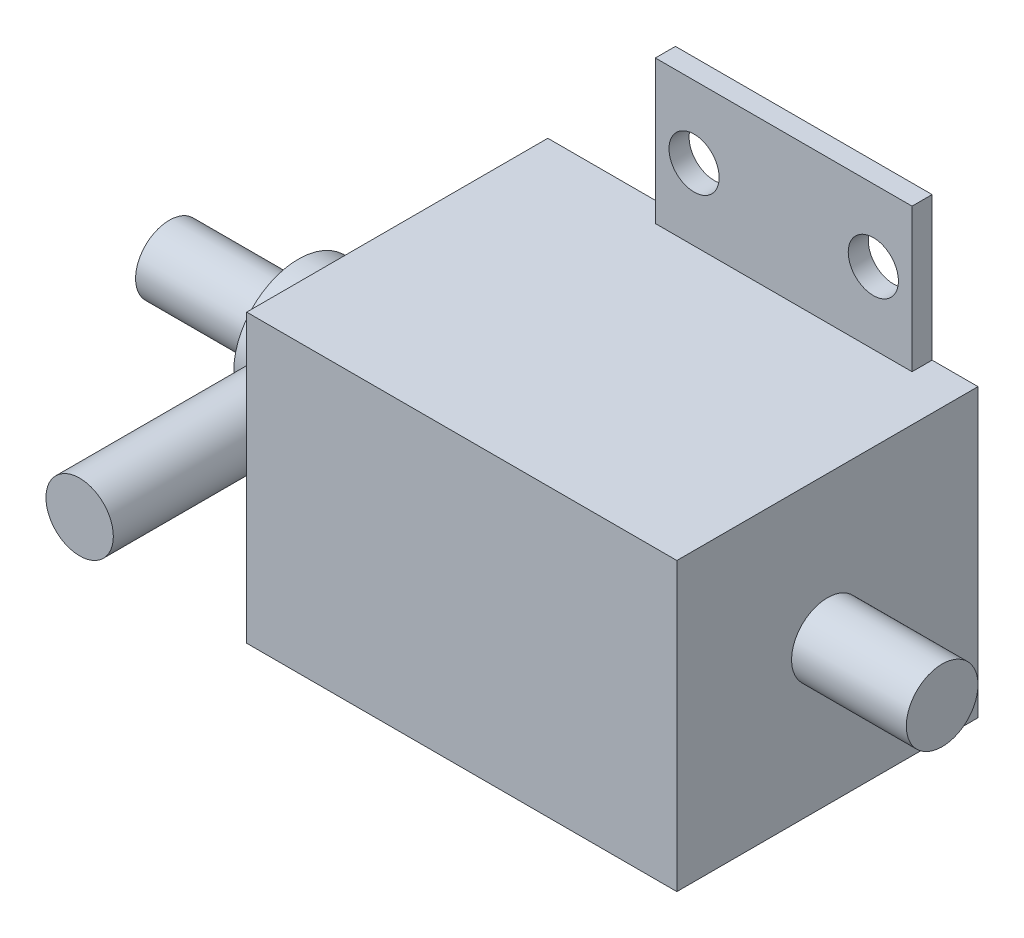
ISO-10303-21;
HEADER;
FILE_DESCRIPTION(('STEP AP214'),'2;1');
FILE_NAME('part.step','',(''),(''),'','','');
FILE_SCHEMA(('AUTOMOTIVE_DESIGN { 1 0 10303 214 1 1 1 1 }'));
ENDSEC;
DATA;
#1=APPLICATION_CONTEXT('core data for automotive mechanical design processes');
#2=APPLICATION_PROTOCOL_DEFINITION('international standard','automotive_design',2000,#1);
#3=PRODUCT_CONTEXT('',#1,'mechanical');
#4=PRODUCT('Part','Part','',(#3));
#5=PRODUCT_RELATED_PRODUCT_CATEGORY('part','',(#4));
#6=PRODUCT_DEFINITION_FORMATION('','',#4);
#7=PRODUCT_DEFINITION_CONTEXT('part definition',#1,'design');
#8=PRODUCT_DEFINITION('design','',#6,#7);
#9=PRODUCT_DEFINITION_SHAPE('','',#8);
#10=(LENGTH_UNIT() NAMED_UNIT(*) SI_UNIT(.MILLI.,.METRE.));
#11=(NAMED_UNIT(*) PLANE_ANGLE_UNIT() SI_UNIT($,.RADIAN.));
#12=(NAMED_UNIT(*) SI_UNIT($,.STERADIAN.) SOLID_ANGLE_UNIT());
#13=UNCERTAINTY_MEASURE_WITH_UNIT(LENGTH_MEASURE(1.E-05),#10,'distance_accuracy_value','');
#14=(GEOMETRIC_REPRESENTATION_CONTEXT(3) GLOBAL_UNCERTAINTY_ASSIGNED_CONTEXT((#13)) GLOBAL_UNIT_ASSIGNED_CONTEXT((#10,
#11,#12)) REPRESENTATION_CONTEXT('',''));
#15=CARTESIAN_POINT('',(0.,0.,0.));
#16=DIRECTION('',(0.,0.,1.));
#17=DIRECTION('',(1.,0.,0.));
#18=AXIS2_PLACEMENT_3D('',#15,#16,#17);
#19=CARTESIAN_POINT('',(-6.9,10.,10.5));
#20=DIRECTION('',(1.,0.,0.));
#21=DIRECTION('',(0.,0.,-1.));
#22=AXIS2_PLACEMENT_3D('',#19,#20,#21);
#23=CYLINDRICAL_SURFACE('',#22,4.5);
#24=CARTESIAN_POINT('',(-6.9,10.,10.5));
#25=DIRECTION('',(-1.,0.,0.));
#26=DIRECTION('',(0.,0.,1.));
#27=AXIS2_PLACEMENT_3D('',#24,#25,#26);
#28=CIRCLE('',#27,4.5);
#29=CARTESIAN_POINT('',(-6.9,10.,15.));
#30=VERTEX_POINT('',#29);
#31=EDGE_CURVE('E418',#30,#30,#28,.T.);
#32=ORIENTED_EDGE('',*,*,#31,.F.);
#33=EDGE_LOOP('',(#32));
#34=FACE_BOUND('',#33,.T.);
#35=CARTESIAN_POINT('',(0.,10.,10.5));
#36=DIRECTION('',(-1.,0.,0.));
#37=DIRECTION('',(0.,0.,1.));
#38=AXIS2_PLACEMENT_3D('',#35,#36,#37);
#39=CIRCLE('',#38,4.5);
#40=CARTESIAN_POINT('',(0.,10.,15.));
#41=VERTEX_POINT('',#40);
#42=EDGE_CURVE('E172',#41,#41,#39,.T.);
#43=ORIENTED_EDGE('',*,*,#42,.T.);
#44=EDGE_LOOP('',(#43));
#45=FACE_BOUND('',#44,.T.);
#46=CARTESIAN_POINT('',(-5.8,10.,15.));
#47=CARTESIAN_POINT('',(-5.79999050258675,9.87712735945314,14.9999917996235));
#48=CARTESIAN_POINT('',(-5.79030594925904,9.75412267066858,14.9949140279917));
#49=CARTESIAN_POINT('',(-5.75201262024037,9.51179391513524,14.9750983324869));
#50=CARTESIAN_POINT('',(-5.72337226729276,9.39247633824944,14.9603442899051));
#51=CARTESIAN_POINT('',(-5.64861623785411,9.16138430430259,14.9227115553152));
#52=CARTESIAN_POINT('',(-5.60257039822079,9.04958177846906,14.8998653546249));
#53=CARTESIAN_POINT('',(-5.49469427309772,8.83547867671817,14.8481075946849));
#54=CARTESIAN_POINT('',(-5.43286434078681,8.73317788826342,14.8191961711508));
#55=CARTESIAN_POINT('',(-5.29068157164008,8.53359045627463,14.7557374830958));
#56=CARTESIAN_POINT('',(-5.20939382977506,8.43704835498602,14.7209474555591));
#57=CARTESIAN_POINT('',(-5.03262454716928,8.2582711480153,14.650377818532));
#58=CARTESIAN_POINT('',(-4.93713125000027,8.17604801613981,14.6145974095628));
#59=CARTESIAN_POINT('',(-4.7248190372459,8.0210910893819,14.5425037082673));
#60=CARTESIAN_POINT('',(-4.60686991449411,7.94979356272489,14.5064120935414));
#61=CARTESIAN_POINT('',(-4.35849861469447,7.82832854291439,14.4419051481791));
#62=CARTESIAN_POINT('',(-4.22808596129359,7.7781450719963,14.4134840188718));
#63=CARTESIAN_POINT('',(-4.03018597664772,7.72179244151833,14.3807460608625));
#64=CARTESIAN_POINT('',(-3.96599931057312,7.70639445093791,14.3716389021419));
#65=CARTESIAN_POINT('',(-3.83622171430019,7.68101438658094,14.3564917105535));
#66=CARTESIAN_POINT('',(-3.77063158425604,7.67102930799433,14.3504499761301));
#67=CARTESIAN_POINT('',(-3.63866688997946,7.65664631679156,14.3417138891824));
#68=CARTESIAN_POINT('',(-3.57229294411421,7.65224426269739,14.3390170554493));
#69=CARTESIAN_POINT('',(-3.43938211070539,7.64908266071205,14.3370803465321));
#70=CARTESIAN_POINT('',(-3.37284524222002,7.6503224816728,14.3378400846664));
#71=CARTESIAN_POINT('',(-3.1916869113921,7.66141650415281,14.3446238778164));
#72=CARTESIAN_POINT('',(-3.07747841096215,7.67690642454189,14.3540908571606));
#73=CARTESIAN_POINT('',(-2.85367708046191,7.72403493838362,14.3821006905409));
#74=CARTESIAN_POINT('',(-2.74408598084508,7.75567952882671,14.4006469148996));
#75=CARTESIAN_POINT('',(-2.5294150108826,7.83472778455303,14.4450839547977));
#76=CARTESIAN_POINT('',(-2.42449570180883,7.88247541267053,14.4711330880216));
#77=CARTESIAN_POINT('',(-2.22364093246978,7.99210201526089,14.5276723601848));
#78=CARTESIAN_POINT('',(-2.12770951950013,8.05398731328084,14.5581644841836));
#79=CARTESIAN_POINT('',(-1.93340849483689,8.20021492855338,14.6253009713301));
#80=CARTESIAN_POINT('',(-1.83657776903885,8.2864882720417,14.6622090044749));
#81=CARTESIAN_POINT('',(-1.65808414876586,8.47411787187336,14.7345955938479));
#82=CARTESIAN_POINT('',(-1.57642980637864,8.57548257480153,14.770073335324));
#83=CARTESIAN_POINT('',(-1.42634396153612,8.79741310270954,14.8379670388562));
#84=CARTESIAN_POINT('',(-1.35888471487203,8.91872763321212,14.8701079115793));
#85=CARTESIAN_POINT('',(-1.24590862465051,9.17307955280697,14.9252772579122));
#86=CARTESIAN_POINT('',(-1.20037291039874,9.30610674311709,14.948313565212));
#87=CARTESIAN_POINT('',(-1.1365497492368,9.56762664716768,14.9809455013198));
#88=CARTESIAN_POINT('',(-1.11622468490803,9.69549566554691,14.9915418069529));
#89=CARTESIAN_POINT('',(-1.09691950122816,9.95324573178309,15.0016009935437));
#90=CARTESIAN_POINT('',(-1.09792783261086,10.0831256529408,15.0010698985467));
#91=CARTESIAN_POINT('',(-1.12018752084328,10.3292768311304,14.9894829537845));
#92=CARTESIAN_POINT('',(-1.13968683830117,10.4457562628172,14.979338075249));
#93=CARTESIAN_POINT('',(-1.19553384964207,10.6735246819125,14.9507912725635));
#94=CARTESIAN_POINT('',(-1.23188332980117,10.7848131176495,14.9323884730025));
#95=CARTESIAN_POINT('',(-1.32120972835373,11.00247808673,14.888359742944));
#96=CARTESIAN_POINT('',(-1.37459940926389,11.1086480182231,14.8625563166244));
#97=CARTESIAN_POINT('',(-1.49600212069132,11.3108453133868,14.8061259380623));
#98=CARTESIAN_POINT('',(-1.56402106495832,11.4068685518675,14.7754970365076));
#99=CARTESIAN_POINT('',(-1.72093071678965,11.5967253618906,14.7085187007419));
#100=CARTESIAN_POINT('',(-1.81126070642594,11.6892782758137,14.6719060458203));
#101=CARTESIAN_POINT('',(-2.00605451324781,11.8585456444917,14.5993058035534));
#102=CARTESIAN_POINT('',(-2.11053018605356,11.935246675937,14.5633187694044));
#103=CARTESIAN_POINT('',(-2.33853325137128,12.0751112603689,14.4937930642912));
#104=CARTESIAN_POINT('',(-2.46283232323431,12.1371698397141,14.460535795147));
#105=CARTESIAN_POINT('',(-2.72236508661469,12.2388388712781,14.4039761189985));
#106=CARTESIAN_POINT('',(-2.85758330978649,12.2784804638866,14.3806599135804));
#107=CARTESIAN_POINT('',(-3.12105036508704,12.3303453455324,14.3497172874925));
#108=CARTESIAN_POINT('',(-3.24868701990494,12.3448714263731,14.3407791685522));
#109=CARTESIAN_POINT('',(-3.5048359647913,12.352845520553,14.3359034137056));
#110=CARTESIAN_POINT('',(-3.63334769835871,12.3463058713832,14.3399581683022));
#111=CARTESIAN_POINT('',(-3.87228543121303,12.3145315826846,14.3591722228985));
#112=CARTESIAN_POINT('',(-3.98312104261154,12.2914802045373,14.3730325479518));
#113=CARTESIAN_POINT('',(-4.19917643888149,12.2302134133046,14.408630951681));
#114=CARTESIAN_POINT('',(-4.30439424033875,12.191992684197,14.4303717918118));
#115=CARTESIAN_POINT('',(-4.51394499515606,12.0986982839221,14.4810111857787));
#116=CARTESIAN_POINT('',(-4.61776371808717,12.0426808083395,14.5102867190122));
#117=CARTESIAN_POINT('',(-4.81522062752771,11.9163582571726,14.5721640033092));
#118=CARTESIAN_POINT('',(-4.90885330516307,11.8460455087294,14.6047675359471));
#119=CARTESIAN_POINT('',(-5.09662546221643,11.6818792670805,14.6749590447953));
#120=CARTESIAN_POINT('',(-5.1890836645904,11.5861215339478,14.7126190021696));
#121=CARTESIAN_POINT('',(-5.35707959710248,11.3795981920157,14.7847044898988));
#122=CARTESIAN_POINT('',(-5.4326070694349,11.2688235497996,14.8191280521292));
#123=CARTESIAN_POINT('',(-5.5655516630985,11.0322845616421,14.881728422698));
#124=CARTESIAN_POINT('',(-5.62261948159928,10.9062869022155,14.9097820510935));
#125=CARTESIAN_POINT('',(-5.69115776932798,10.7102932394903,14.94408746741));
#126=CARTESIAN_POINT('',(-5.71115255376822,10.6438409171047,14.9542227338703));
#127=CARTESIAN_POINT('',(-5.74524483104006,10.5090870440803,14.9716249644287));
#128=CARTESIAN_POINT('',(-5.75934570866751,10.4407865788706,14.9788935746753));
#129=CARTESIAN_POINT('',(-5.78021852190726,10.3105473431408,14.9896935508893));
#130=CARTESIAN_POINT('',(-5.7876266886867,10.2487365939357,14.9935484015389));
#131=CARTESIAN_POINT('',(-5.79751988953004,10.1246285637152,14.9987037334768));
#132=CARTESIAN_POINT('',(-5.80000481788174,10.0623312722815,15.0000041599163));
#133=CARTESIAN_POINT('',(-5.8,10.,15.));
#134=B_SPLINE_CURVE_WITH_KNOTS('',3,(#46,#47,#48,#49,#50,#51,#52,#53,#54,#55,#56,#57,#58,#59,
#60,#61,#62,#63,#64,#65,#66,#67,#68,#69,#70,#71,#72,#73,#74,#75,#76,#77,#78,#79,#80,#81,#82,#83,
#84,#85,#86,#87,#88,#89,#90,#91,#92,#93,#94,#95,#96,#97,#98,#99,#100,#101,#102,#103,#104,#105,
#106,#107,#108,#109,#110,#111,#112,#113,#114,#115,#116,#117,#118,#119,#120,#121,#122,#123,#124,
#125,#126,#127,#128,#129,#130,#131,#132,#133),.UNSPECIFIED.,.T.,.F.,(4,2,2,2,2,2,2,2,2,2,2,2,2,
2,2,2,2,2,2,2,2,2,2,2,2,2,2,2,2,2,2,2,2,2,2,2,2,2,2,2,2,2,2,4),(0.,0.368375960983142,
0.737367125704208,1.10489321988235,1.47241109115798,1.86354359223129,2.25500161172279,
2.68032448950331,3.10532492875575,3.30497263237539,3.50450939398432,3.70389805282645,
3.90326440690655,4.24840035553353,4.59366451994539,4.94682738676373,5.30014852787692,
5.70293431079988,6.10594638506285,6.53108772485344,6.95586246682043,7.34342475158205,
7.73077722701632,8.08474754113718,8.43875538803266,8.80208816020687,9.16556808340911,
9.56708452870366,9.96893959584834,10.3951985998747,10.8208640055605,11.2048896537137,
11.5886904318341,11.9293648668494,12.2701587950628,12.6333874230207,12.9968115278267,
13.4099280649239,13.8232942241031,14.2440780602608,14.4541992068345,14.6641995171535,
14.8510665789481,15.0379376531254),.UNSPECIFIED.);
#135=CARTESIAN_POINT('',(-5.8,10.,15.));
#136=VERTEX_POINT('',#135);
#137=EDGE_CURVE('E11',#136,#136,#134,.T.);
#138=ORIENTED_EDGE('',*,*,#137,.F.);
#139=EDGE_LOOP('',(#138));
#140=FACE_BOUND('',#139,.T.);
#141=ADVANCED_FACE('F41',(#34,#45,#140),#23,.T.);
#142=CARTESIAN_POINT('',(0.,20.,21.));
#143=DIRECTION('',(0.,-1.,0.));
#144=DIRECTION('',(0.,0.,-1.));
#145=AXIS2_PLACEMENT_3D('',#142,#143,#144);
#146=PLANE('',#145);
#147=DIRECTION('',(0.,0.,-1.));
#148=VECTOR('',#147,1.);
#149=CARTESIAN_POINT('',(26.8,20.,1.4));
#150=LINE('',#149,#148);
#151=CARTESIAN_POINT('',(26.8,20.,1.4));
#152=VERTEX_POINT('',#151);
#153=CARTESIAN_POINT('',(26.8,20.,0.));
#154=VERTEX_POINT('',#153);
#155=EDGE_CURVE('E61',#152,#154,#150,.T.);
#156=ORIENTED_EDGE('',*,*,#155,.F.);
#157=DIRECTION('',(1.,0.,0.));
#158=VECTOR('',#157,1.);
#159=CARTESIAN_POINT('',(8.9,20.,1.4));
#160=LINE('',#159,#158);
#161=CARTESIAN_POINT('',(8.9,20.,1.4));
#162=VERTEX_POINT('',#161);
#163=EDGE_CURVE('E131',#162,#152,#160,.T.);
#164=ORIENTED_EDGE('',*,*,#163,.F.);
#165=DIRECTION('',(0.,0.,1.));
#166=VECTOR('',#165,1.);
#167=CARTESIAN_POINT('',(8.9,20.,0.));
#168=LINE('',#167,#166);
#169=CARTESIAN_POINT('',(8.9,20.,0.));
#170=VERTEX_POINT('',#169);
#171=EDGE_CURVE('E67',#170,#162,#168,.T.);
#172=ORIENTED_EDGE('',*,*,#171,.F.);
#173=DIRECTION('',(-1.,0.,0.));
#174=VECTOR('',#173,1.);
#175=CARTESIAN_POINT('',(0.,20.,0.));
#176=LINE('',#175,#174);
#177=CARTESIAN_POINT('',(0.,20.,0.));
#178=VERTEX_POINT('',#177);
#179=EDGE_CURVE('E157',#170,#178,#176,.T.);
#180=ORIENTED_EDGE('',*,*,#179,.T.);
#181=DIRECTION('',(0.,0.,-1.));
#182=VECTOR('',#181,1.);
#183=CARTESIAN_POINT('',(0.,20.,21.));
#184=LINE('',#183,#182);
#185=CARTESIAN_POINT('',(0.,20.,21.));
#186=VERTEX_POINT('',#185);
#187=EDGE_CURVE('E152',#186,#178,#184,.T.);
#188=ORIENTED_EDGE('',*,*,#187,.F.);
#189=DIRECTION('',(-1.,0.,0.));
#190=VECTOR('',#189,1.);
#191=CARTESIAN_POINT('',(0.,20.,21.));
#192=LINE('',#191,#190);
#193=CARTESIAN_POINT('',(30.,20.,21.));
#194=VERTEX_POINT('',#193);
#195=EDGE_CURVE('E151',#194,#186,#192,.T.);
#196=ORIENTED_EDGE('',*,*,#195,.F.);
#197=DIRECTION('',(0.,0.,-1.));
#198=VECTOR('',#197,1.);
#199=CARTESIAN_POINT('',(30.,20.,21.));
#200=LINE('',#199,#198);
#201=CARTESIAN_POINT('',(30.,20.,0.));
#202=VERTEX_POINT('',#201);
#203=EDGE_CURVE('E161',#194,#202,#200,.T.);
#204=ORIENTED_EDGE('',*,*,#203,.T.);
#205=EDGE_CURVE('E147',#202,#154,#176,.T.);
#206=ORIENTED_EDGE('',*,*,#205,.T.);
#207=EDGE_LOOP('',(#156,#164,#172,#180,#188,#196,#204,#206));
#208=FACE_BOUND('',#207,.T.);
#209=ADVANCED_FACE('F203',(#208),#146,.F.);
#210=CARTESIAN_POINT('',(0.,0.,21.));
#211=DIRECTION('',(1.,0.,0.));
#212=DIRECTION('',(0.,0.,-1.));
#213=AXIS2_PLACEMENT_3D('',#210,#211,#212);
#214=PLANE('',#213);
#215=ORIENTED_EDGE('',*,*,#42,.F.);
#216=EDGE_LOOP('',(#215));
#217=FACE_BOUND('',#216,.T.);
#218=DIRECTION('',(0.,-1.,0.));
#219=VECTOR('',#218,1.);
#220=CARTESIAN_POINT('',(0.,0.,0.));
#221=LINE('',#220,#219);
#222=CARTESIAN_POINT('',(0.,0.,0.));
#223=VERTEX_POINT('',#222);
#224=EDGE_CURVE('E134',#178,#223,#221,.T.);
#225=ORIENTED_EDGE('',*,*,#224,.T.);
#226=DIRECTION('',(0.,0.,-1.));
#227=VECTOR('',#226,1.);
#228=CARTESIAN_POINT('',(0.,0.,21.));
#229=LINE('',#228,#227);
#230=CARTESIAN_POINT('',(0.,0.,21.));
#231=VERTEX_POINT('',#230);
#232=EDGE_CURVE('E166',#231,#223,#229,.T.);
#233=ORIENTED_EDGE('',*,*,#232,.F.);
#234=DIRECTION('',(0.,-1.,0.));
#235=VECTOR('',#234,1.);
#236=CARTESIAN_POINT('',(0.,0.,21.));
#237=LINE('',#236,#235);
#238=EDGE_CURVE('E143',#186,#231,#237,.T.);
#239=ORIENTED_EDGE('',*,*,#238,.F.);
#240=ORIENTED_EDGE('',*,*,#187,.T.);
#241=EDGE_LOOP('',(#225,#233,#239,#240));
#242=FACE_BOUND('',#241,.T.);
#243=ADVANCED_FACE('F43',(#217,#242),#214,.F.);
#244=CARTESIAN_POINT('',(0.,0.,21.));
#245=DIRECTION('',(0.,1.,0.));
#246=DIRECTION('',(0.,0.,1.));
#247=AXIS2_PLACEMENT_3D('',#244,#245,#246);
#248=PLANE('',#247);
#249=DIRECTION('',(1.,0.,0.));
#250=VECTOR('',#249,1.);
#251=CARTESIAN_POINT('',(0.,0.,0.));
#252=LINE('',#251,#250);
#253=CARTESIAN_POINT('',(30.,0.,0.));
#254=VERTEX_POINT('',#253);
#255=EDGE_CURVE('E137',#223,#254,#252,.T.);
#256=ORIENTED_EDGE('',*,*,#255,.T.);
#257=DIRECTION('',(0.,0.,-1.));
#258=VECTOR('',#257,1.);
#259=CARTESIAN_POINT('',(30.,0.,21.));
#260=LINE('',#259,#258);
#261=CARTESIAN_POINT('',(30.,0.,21.));
#262=VERTEX_POINT('',#261);
#263=EDGE_CURVE('E164',#262,#254,#260,.T.);
#264=ORIENTED_EDGE('',*,*,#263,.F.);
#265=DIRECTION('',(1.,0.,0.));
#266=VECTOR('',#265,1.);
#267=CARTESIAN_POINT('',(0.,0.,21.));
#268=LINE('',#267,#266);
#269=EDGE_CURVE('E146',#231,#262,#268,.T.);
#270=ORIENTED_EDGE('',*,*,#269,.F.);
#271=ORIENTED_EDGE('',*,*,#232,.T.);
#272=EDGE_LOOP('',(#256,#264,#270,#271));
#273=FACE_BOUND('',#272,.T.);
#274=ADVANCED_FACE('F362',(#273),#248,.F.);
#275=CARTESIAN_POINT('',(30.,0.,21.));
#276=DIRECTION('',(-1.,0.,0.));
#277=DIRECTION('',(0.,0.,1.));
#278=AXIS2_PLACEMENT_3D('',#275,#276,#277);
#279=PLANE('',#278);
#280=CARTESIAN_POINT('',(30.,10.,10.5));
#281=DIRECTION('',(1.,0.,0.));
#282=DIRECTION('',(0.,0.,-1.));
#283=AXIS2_PLACEMENT_3D('',#280,#281,#282);
#284=CIRCLE('',#283,2.5);
#285=CARTESIAN_POINT('',(30.,10.,8.));
#286=VERTEX_POINT('',#285);
#287=EDGE_CURVE('E168',#286,#286,#284,.T.);
#288=ORIENTED_EDGE('',*,*,#287,.F.);
#289=EDGE_LOOP('',(#288));
#290=FACE_BOUND('',#289,.T.);
#291=DIRECTION('',(0.,1.,0.));
#292=VECTOR('',#291,1.);
#293=CARTESIAN_POINT('',(30.,0.,0.));
#294=LINE('',#293,#292);
#295=EDGE_CURVE('E155',#254,#202,#294,.T.);
#296=ORIENTED_EDGE('',*,*,#295,.T.);
#297=ORIENTED_EDGE('',*,*,#203,.F.);
#298=DIRECTION('',(0.,1.,0.));
#299=VECTOR('',#298,1.);
#300=CARTESIAN_POINT('',(30.,0.,21.));
#301=LINE('',#300,#299);
#302=EDGE_CURVE('E149',#262,#194,#301,.T.);
#303=ORIENTED_EDGE('',*,*,#302,.F.);
#304=ORIENTED_EDGE('',*,*,#263,.T.);
#305=EDGE_LOOP('',(#296,#297,#303,#304));
#306=FACE_BOUND('',#305,.T.);
#307=ADVANCED_FACE('F354',(#290,#306),#279,.F.);
#308=CARTESIAN_POINT('',(0.,0.,21.));
#309=DIRECTION('',(0.,0.,-1.));
#310=DIRECTION('',(-1.,0.,0.));
#311=AXIS2_PLACEMENT_3D('',#308,#309,#310);
#312=PLANE('',#311);
#313=ORIENTED_EDGE('',*,*,#238,.T.);
#314=ORIENTED_EDGE('',*,*,#269,.T.);
#315=ORIENTED_EDGE('',*,*,#302,.T.);
#316=ORIENTED_EDGE('',*,*,#195,.T.);
#317=EDGE_LOOP('',(#313,#314,#315,#316));
#318=FACE_BOUND('',#317,.T.);
#319=ADVANCED_FACE('F338',(#318),#312,.F.);
#320=CARTESIAN_POINT('',(0.,0.,0.));
#321=DIRECTION('',(0.,0.,-1.));
#322=DIRECTION('',(-1.,0.,0.));
#323=AXIS2_PLACEMENT_3D('',#320,#321,#322);
#324=PLANE('',#323);
#325=CARTESIAN_POINT('',(11.6,25.,0.));
#326=DIRECTION('',(0.,0.,1.));
#327=DIRECTION('',(1.,0.,0.));
#328=AXIS2_PLACEMENT_3D('',#325,#326,#327);
#329=CIRCLE('',#328,1.75);
#330=CARTESIAN_POINT('',(13.35,25.,0.));
#331=VERTEX_POINT('',#330);
#332=EDGE_CURVE('E399',#331,#331,#329,.T.);
#333=ORIENTED_EDGE('',*,*,#332,.T.);
#334=EDGE_LOOP('',(#333));
#335=FACE_BOUND('',#334,.T.);
#336=CARTESIAN_POINT('',(24.1,25.,0.));
#337=DIRECTION('',(0.,0.,1.));
#338=DIRECTION('',(-1.,0.,0.));
#339=AXIS2_PLACEMENT_3D('',#336,#337,#338);
#340=CIRCLE('',#339,1.75);
#341=CARTESIAN_POINT('',(22.35,25.,0.));
#342=VERTEX_POINT('',#341);
#343=EDGE_CURVE('E402',#342,#342,#340,.T.);
#344=ORIENTED_EDGE('',*,*,#343,.T.);
#345=EDGE_LOOP('',(#344));
#346=FACE_BOUND('',#345,.T.);
#347=ORIENTED_EDGE('',*,*,#224,.F.);
#348=ORIENTED_EDGE('',*,*,#179,.F.);
#349=DIRECTION('',(0.,-1.,0.));
#350=VECTOR('',#349,1.);
#351=CARTESIAN_POINT('',(8.9,30.,0.));
#352=LINE('',#351,#350);
#353=CARTESIAN_POINT('',(8.9,30.,0.));
#354=VERTEX_POINT('',#353);
#355=EDGE_CURVE('E118',#354,#170,#352,.T.);
#356=ORIENTED_EDGE('',*,*,#355,.F.);
#357=DIRECTION('',(-1.,0.,0.));
#358=VECTOR('',#357,1.);
#359=CARTESIAN_POINT('',(26.8,30.,0.));
#360=LINE('',#359,#358);
#361=CARTESIAN_POINT('',(26.8,30.,0.));
#362=VERTEX_POINT('',#361);
#363=EDGE_CURVE('E110',#362,#354,#360,.T.);
#364=ORIENTED_EDGE('',*,*,#363,.F.);
#365=DIRECTION('',(0.,-1.,0.));
#366=VECTOR('',#365,1.);
#367=CARTESIAN_POINT('',(26.8,30.,0.));
#368=LINE('',#367,#366);
#369=EDGE_CURVE('E116',#362,#154,#368,.T.);
#370=ORIENTED_EDGE('',*,*,#369,.T.);
#371=ORIENTED_EDGE('',*,*,#205,.F.);
#372=ORIENTED_EDGE('',*,*,#295,.F.);
#373=ORIENTED_EDGE('',*,*,#255,.F.);
#374=EDGE_LOOP('',(#347,#348,#356,#364,#370,#371,#372,#373));
#375=FACE_BOUND('',#374,.T.);
#376=ADVANCED_FACE('F113',(#335,#346,#375),#324,.T.);
#377=CARTESIAN_POINT('',(26.8,30.,1.4));
#378=DIRECTION('',(-1.,0.,0.));
#379=DIRECTION('',(0.,0.,1.));
#380=AXIS2_PLACEMENT_3D('',#377,#378,#379);
#381=PLANE('',#380);
#382=ORIENTED_EDGE('',*,*,#155,.T.);
#383=ORIENTED_EDGE('',*,*,#369,.F.);
#384=DIRECTION('',(0.,0.,-1.));
#385=VECTOR('',#384,1.);
#386=CARTESIAN_POINT('',(26.8,30.,1.4));
#387=LINE('',#386,#385);
#388=CARTESIAN_POINT('',(26.8,30.,1.4));
#389=VERTEX_POINT('',#388);
#390=EDGE_CURVE('E122',#389,#362,#387,.T.);
#391=ORIENTED_EDGE('',*,*,#390,.F.);
#392=DIRECTION('',(0.,-1.,0.));
#393=VECTOR('',#392,1.);
#394=CARTESIAN_POINT('',(26.8,30.,1.4));
#395=LINE('',#394,#393);
#396=EDGE_CURVE('E183',#389,#152,#395,.T.);
#397=ORIENTED_EDGE('',*,*,#396,.T.);
#398=EDGE_LOOP('',(#382,#383,#391,#397));
#399=FACE_BOUND('',#398,.T.);
#400=ADVANCED_FACE('F133',(#399),#381,.F.);
#401=CARTESIAN_POINT('',(8.9,30.,0.));
#402=DIRECTION('',(1.,0.,0.));
#403=DIRECTION('',(0.,0.,-1.));
#404=AXIS2_PLACEMENT_3D('',#401,#402,#403);
#405=PLANE('',#404);
#406=ORIENTED_EDGE('',*,*,#171,.T.);
#407=DIRECTION('',(0.,-1.,0.));
#408=VECTOR('',#407,1.);
#409=CARTESIAN_POINT('',(8.9,30.,1.4));
#410=LINE('',#409,#408);
#411=CARTESIAN_POINT('',(8.9,30.,1.4));
#412=VERTEX_POINT('',#411);
#413=EDGE_CURVE('E139',#412,#162,#410,.T.);
#414=ORIENTED_EDGE('',*,*,#413,.F.);
#415=DIRECTION('',(0.,0.,1.));
#416=VECTOR('',#415,1.);
#417=CARTESIAN_POINT('',(8.9,30.,0.));
#418=LINE('',#417,#416);
#419=EDGE_CURVE('E121',#354,#412,#418,.T.);
#420=ORIENTED_EDGE('',*,*,#419,.F.);
#421=ORIENTED_EDGE('',*,*,#355,.T.);
#422=EDGE_LOOP('',(#406,#414,#420,#421));
#423=FACE_BOUND('',#422,.T.);
#424=ADVANCED_FACE('F192',(#423),#405,.F.);
#425=CARTESIAN_POINT('',(8.9,30.,1.4));
#426=DIRECTION('',(0.,0.,-1.));
#427=DIRECTION('',(-1.,0.,0.));
#428=AXIS2_PLACEMENT_3D('',#425,#426,#427);
#429=PLANE('',#428);
#430=CARTESIAN_POINT('',(11.6,25.,1.4));
#431=DIRECTION('',(0.,0.,1.));
#432=DIRECTION('',(1.,0.,0.));
#433=AXIS2_PLACEMENT_3D('',#430,#431,#432);
#434=CIRCLE('',#433,1.75);
#435=CARTESIAN_POINT('',(13.35,25.,1.4));
#436=VERTEX_POINT('',#435);
#437=EDGE_CURVE('E403',#436,#436,#434,.T.);
#438=ORIENTED_EDGE('',*,*,#437,.F.);
#439=EDGE_LOOP('',(#438));
#440=FACE_BOUND('',#439,.T.);
#441=CARTESIAN_POINT('',(24.1,25.,1.4));
#442=DIRECTION('',(0.,0.,1.));
#443=DIRECTION('',(-1.,0.,0.));
#444=AXIS2_PLACEMENT_3D('',#441,#442,#443);
#445=CIRCLE('',#444,1.75);
#446=CARTESIAN_POINT('',(22.35,25.,1.4));
#447=VERTEX_POINT('',#446);
#448=EDGE_CURVE('E404',#447,#447,#445,.T.);
#449=ORIENTED_EDGE('',*,*,#448,.F.);
#450=EDGE_LOOP('',(#449));
#451=FACE_BOUND('',#450,.T.);
#452=ORIENTED_EDGE('',*,*,#163,.T.);
#453=ORIENTED_EDGE('',*,*,#396,.F.);
#454=DIRECTION('',(1.,0.,0.));
#455=VECTOR('',#454,1.);
#456=CARTESIAN_POINT('',(8.9,30.,1.4));
#457=LINE('',#456,#455);
#458=EDGE_CURVE('E127',#412,#389,#457,.T.);
#459=ORIENTED_EDGE('',*,*,#458,.F.);
#460=ORIENTED_EDGE('',*,*,#413,.T.);
#461=EDGE_LOOP('',(#452,#453,#459,#460));
#462=FACE_BOUND('',#461,.T.);
#463=ADVANCED_FACE('F190',(#440,#451,#462),#429,.F.);
#464=CARTESIAN_POINT('',(0.,30.,0.));
#465=DIRECTION('',(0.,1.,0.));
#466=DIRECTION('',(0.,0.,1.));
#467=AXIS2_PLACEMENT_3D('',#464,#465,#466);
#468=PLANE('',#467);
#469=ORIENTED_EDGE('',*,*,#390,.T.);
#470=ORIENTED_EDGE('',*,*,#363,.T.);
#471=ORIENTED_EDGE('',*,*,#419,.T.);
#472=ORIENTED_EDGE('',*,*,#458,.T.);
#473=EDGE_LOOP('',(#469,#470,#471,#472));
#474=FACE_BOUND('',#473,.T.);
#475=ADVANCED_FACE('F125',(#474),#468,.T.);
#476=CARTESIAN_POINT('',(38.,10.,10.5));
#477=DIRECTION('',(-1.,0.,0.));
#478=DIRECTION('',(0.,0.,1.));
#479=AXIS2_PLACEMENT_3D('',#476,#477,#478);
#480=CYLINDRICAL_SURFACE('',#479,2.5);
#481=CARTESIAN_POINT('',(38.,10.,10.5));
#482=DIRECTION('',(1.,0.,0.));
#483=DIRECTION('',(0.,0.,-1.));
#484=AXIS2_PLACEMENT_3D('',#481,#482,#483);
#485=CIRCLE('',#484,2.5);
#486=CARTESIAN_POINT('',(38.,10.,8.));
#487=VERTEX_POINT('',#486);
#488=EDGE_CURVE('E179',#487,#487,#485,.T.);
#489=ORIENTED_EDGE('',*,*,#488,.F.);
#490=EDGE_LOOP('',(#489));
#491=FACE_BOUND('',#490,.T.);
#492=ORIENTED_EDGE('',*,*,#287,.T.);
#493=EDGE_LOOP('',(#492));
#494=FACE_BOUND('',#493,.T.);
#495=ADVANCED_FACE('F219',(#491,#494),#480,.T.);
#496=CARTESIAN_POINT('',(38.,10.,10.5));
#497=DIRECTION('',(1.,0.,0.));
#498=DIRECTION('',(0.,0.,-1.));
#499=AXIS2_PLACEMENT_3D('',#496,#497,#498);
#500=PLANE('',#499);
#501=ORIENTED_EDGE('',*,*,#488,.T.);
#502=EDGE_LOOP('',(#501));
#503=FACE_BOUND('',#502,.T.);
#504=ADVANCED_FACE('F216',(#503),#500,.T.);
#505=CARTESIAN_POINT('',(-6.9,10.,10.5));
#506=DIRECTION('',(-1.,0.,0.));
#507=DIRECTION('',(0.,0.,1.));
#508=AXIS2_PLACEMENT_3D('',#505,#506,#507);
#509=PLANE('',#508);
#510=CARTESIAN_POINT('',(-6.9,10.,10.5));
#511=DIRECTION('',(-1.,0.,0.));
#512=DIRECTION('',(0.,0.,1.));
#513=AXIS2_PLACEMENT_3D('',#510,#511,#512);
#514=CIRCLE('',#513,2.35);
#515=CARTESIAN_POINT('',(-6.9,10.,12.85));
#516=VERTEX_POINT('',#515);
#517=EDGE_CURVE('E54',#516,#516,#514,.T.);
#518=ORIENTED_EDGE('',*,*,#517,.F.);
#519=EDGE_LOOP('',(#518));
#520=FACE_BOUND('',#519,.T.);
#521=ORIENTED_EDGE('',*,*,#31,.T.);
#522=EDGE_LOOP('',(#521));
#523=FACE_BOUND('',#522,.T.);
#524=ADVANCED_FACE('F214',(#520,#523),#509,.T.);
#525=CARTESIAN_POINT('',(-15.9,10.,10.5));
#526=DIRECTION('',(1.,0.,0.));
#527=DIRECTION('',(0.,0.,-1.));
#528=AXIS2_PLACEMENT_3D('',#525,#526,#527);
#529=CYLINDRICAL_SURFACE('',#528,2.35);
#530=CARTESIAN_POINT('',(-15.9,10.,10.5));
#531=DIRECTION('',(-1.,0.,0.));
#532=DIRECTION('',(0.,0.,1.));
#533=AXIS2_PLACEMENT_3D('',#530,#531,#532);
#534=CIRCLE('',#533,2.35);
#535=CARTESIAN_POINT('',(-15.9,10.,12.85));
#536=VERTEX_POINT('',#535);
#537=EDGE_CURVE('E415',#536,#536,#534,.T.);
#538=ORIENTED_EDGE('',*,*,#537,.F.);
#539=EDGE_LOOP('',(#538));
#540=FACE_BOUND('',#539,.T.);
#541=ORIENTED_EDGE('',*,*,#517,.T.);
#542=EDGE_LOOP('',(#541));
#543=FACE_BOUND('',#542,.T.);
#544=ADVANCED_FACE('F245',(#540,#543),#529,.T.);
#545=CARTESIAN_POINT('',(-15.9,10.,10.5));
#546=DIRECTION('',(-1.,0.,0.));
#547=DIRECTION('',(0.,0.,1.));
#548=AXIS2_PLACEMENT_3D('',#545,#546,#547);
#549=PLANE('',#548);
#550=ORIENTED_EDGE('',*,*,#537,.T.);
#551=EDGE_LOOP('',(#550));
#552=FACE_BOUND('',#551,.T.);
#553=ADVANCED_FACE('F252',(#552),#549,.T.);
#554=CARTESIAN_POINT('',(-3.45,10.,29.2));
#555=DIRECTION('',(0.,0.,-1.));
#556=DIRECTION('',(-1.,0.,0.));
#557=AXIS2_PLACEMENT_3D('',#554,#555,#556);
#558=CYLINDRICAL_SURFACE('',#557,2.35);
#559=CARTESIAN_POINT('',(-3.45,10.,29.2));
#560=DIRECTION('',(0.,0.,1.));
#561=DIRECTION('',(1.,0.,0.));
#562=AXIS2_PLACEMENT_3D('',#559,#560,#561);
#563=CIRCLE('',#562,2.35);
#564=CARTESIAN_POINT('',(-1.1,10.,29.2));
#565=VERTEX_POINT('',#564);
#566=EDGE_CURVE('E412',#565,#565,#563,.T.);
#567=ORIENTED_EDGE('',*,*,#566,.F.);
#568=EDGE_LOOP('',(#567));
#569=FACE_BOUND('',#568,.T.);
#570=ORIENTED_EDGE('',*,*,#137,.T.);
#571=EDGE_LOOP('',(#570));
#572=FACE_BOUND('',#571,.T.);
#573=ADVANCED_FACE('F259',(#569,#572),#558,.T.);
#574=CARTESIAN_POINT('',(-3.45,10.,29.2));
#575=DIRECTION('',(0.,0.,1.));
#576=DIRECTION('',(1.,0.,0.));
#577=AXIS2_PLACEMENT_3D('',#574,#575,#576);
#578=PLANE('',#577);
#579=ORIENTED_EDGE('',*,*,#566,.T.);
#580=EDGE_LOOP('',(#579));
#581=FACE_BOUND('',#580,.T.);
#582=ADVANCED_FACE('F267',(#581),#578,.T.);
#583=CARTESIAN_POINT('',(24.1,25.,0.));
#584=DIRECTION('',(0.,0.,1.));
#585=DIRECTION('',(1.,0.,0.));
#586=AXIS2_PLACEMENT_3D('',#583,#584,#585);
#587=CYLINDRICAL_SURFACE('',#586,1.75);
#588=ORIENTED_EDGE('',*,*,#343,.F.);
#589=EDGE_LOOP('',(#588));
#590=FACE_BOUND('',#589,.T.);
#591=ORIENTED_EDGE('',*,*,#448,.T.);
#592=EDGE_LOOP('',(#591));
#593=FACE_BOUND('',#592,.T.);
#594=ADVANCED_FACE('F274',(#590,#593),#587,.F.);
#595=CARTESIAN_POINT('',(11.6,25.,0.));
#596=DIRECTION('',(0.,0.,1.));
#597=DIRECTION('',(1.,0.,0.));
#598=AXIS2_PLACEMENT_3D('',#595,#596,#597);
#599=CYLINDRICAL_SURFACE('',#598,1.75);
#600=ORIENTED_EDGE('',*,*,#332,.F.);
#601=EDGE_LOOP('',(#600));
#602=FACE_BOUND('',#601,.T.);
#603=ORIENTED_EDGE('',*,*,#437,.T.);
#604=EDGE_LOOP('',(#603));
#605=FACE_BOUND('',#604,.T.);
#606=ADVANCED_FACE('F283',(#602,#605),#599,.F.);
#607=CLOSED_SHELL('',(#141,#209,#243,#274,#307,#319,#376,#400,#424,#463,#475,#495,#504,#524,
#544,#553,#573,#582,#594,#606));
#608=MANIFOLD_SOLID_BREP('B2',#607);
#609=ADVANCED_BREP_SHAPE_REPRESENTATION('',(#18,#608),#14);
#610=SHAPE_DEFINITION_REPRESENTATION(#9,#609);
ENDSEC;
END-ISO-10303-21;
